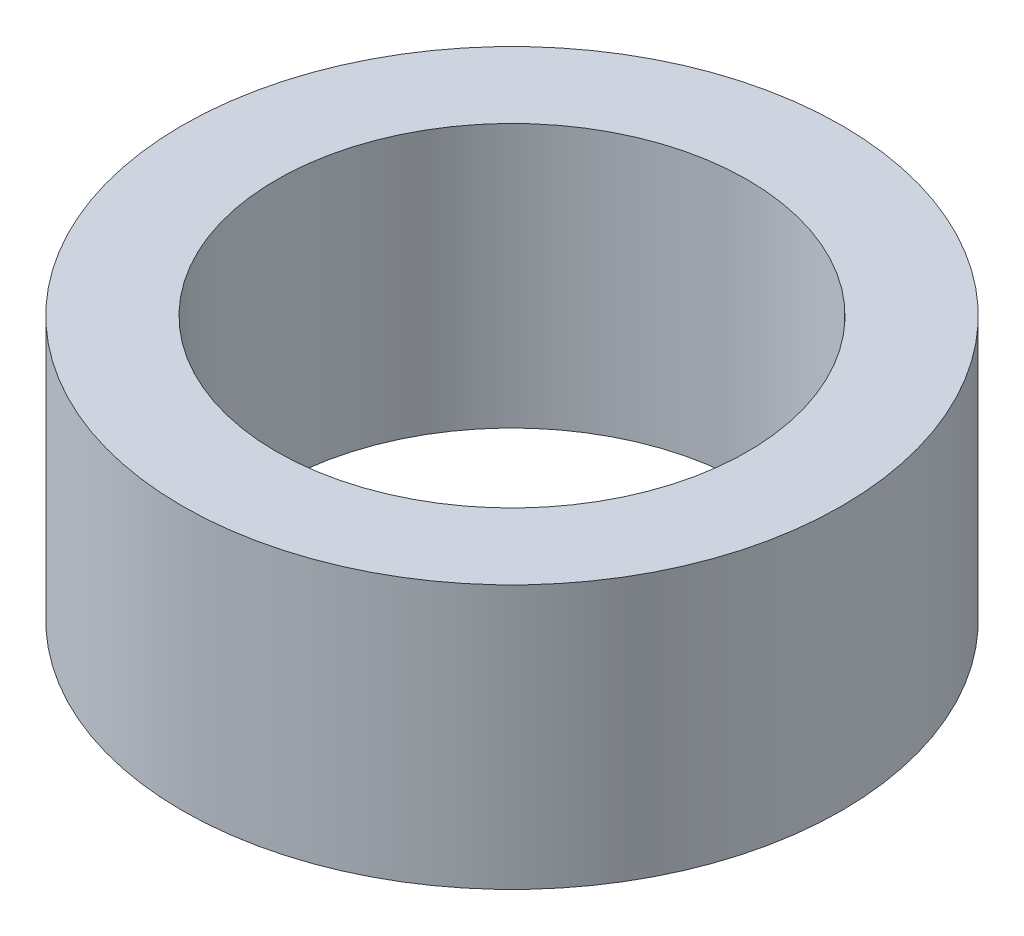
ISO-10303-21;
HEADER;
FILE_DESCRIPTION(('STEP AP214'),'2;1');
FILE_NAME('part.step','',(''),(''),'','','');
FILE_SCHEMA(('AUTOMOTIVE_DESIGN { 1 0 10303 214 1 1 1 1 }'));
ENDSEC;
DATA;
#1=APPLICATION_CONTEXT('core data for automotive mechanical design processes');
#2=APPLICATION_PROTOCOL_DEFINITION('international standard','automotive_design',2000,#1);
#3=PRODUCT_CONTEXT('',#1,'mechanical');
#4=PRODUCT('Part','Part','',(#3));
#5=PRODUCT_RELATED_PRODUCT_CATEGORY('part','',(#4));
#6=PRODUCT_DEFINITION_FORMATION('','',#4);
#7=PRODUCT_DEFINITION_CONTEXT('part definition',#1,'design');
#8=PRODUCT_DEFINITION('design','',#6,#7);
#9=PRODUCT_DEFINITION_SHAPE('','',#8);
#10=(LENGTH_UNIT() NAMED_UNIT(*) SI_UNIT(.MILLI.,.METRE.));
#11=(NAMED_UNIT(*) PLANE_ANGLE_UNIT() SI_UNIT($,.RADIAN.));
#12=(NAMED_UNIT(*) SI_UNIT($,.STERADIAN.) SOLID_ANGLE_UNIT());
#13=UNCERTAINTY_MEASURE_WITH_UNIT(LENGTH_MEASURE(1.E-05),#10,'distance_accuracy_value','');
#14=(GEOMETRIC_REPRESENTATION_CONTEXT(3) GLOBAL_UNCERTAINTY_ASSIGNED_CONTEXT((#13)) GLOBAL_UNIT_ASSIGNED_CONTEXT((#10,
#11,#12)) REPRESENTATION_CONTEXT('',''));
#15=CARTESIAN_POINT('',(0.,0.,0.));
#16=DIRECTION('',(0.,0.,1.));
#17=DIRECTION('',(1.,0.,0.));
#18=AXIS2_PLACEMENT_3D('',#15,#16,#17);
#19=CARTESIAN_POINT('',(0.,-4.445,0.));
#20=DIRECTION('',(0.,1.,0.));
#21=DIRECTION('',(0.,0.,1.));
#22=AXIS2_PLACEMENT_3D('',#19,#20,#21);
#23=CYLINDRICAL_SURFACE('',#22,5.55625);
#24=CARTESIAN_POINT('',(0.,-4.445,0.));
#25=DIRECTION('',(0.,1.,0.));
#26=DIRECTION('',(0.,0.,1.));
#27=AXIS2_PLACEMENT_3D('',#24,#25,#26);
#28=CIRCLE('',#27,5.55625);
#29=CARTESIAN_POINT('',(0.,-4.445,5.55625));
#30=VERTEX_POINT('',#29);
#31=EDGE_CURVE('E10',#30,#30,#28,.T.);
#32=ORIENTED_EDGE('',*,*,#31,.T.);
#33=EDGE_LOOP('',(#32));
#34=FACE_BOUND('',#33,.T.);
#35=CARTESIAN_POINT('',(0.,0.,0.));
#36=DIRECTION('',(0.,1.,0.));
#37=DIRECTION('',(0.,0.,1.));
#38=AXIS2_PLACEMENT_3D('',#35,#36,#37);
#39=CIRCLE('',#38,5.55625);
#40=CARTESIAN_POINT('',(0.,0.,5.55625));
#41=VERTEX_POINT('',#40);
#42=EDGE_CURVE('E42',#41,#41,#39,.T.);
#43=ORIENTED_EDGE('',*,*,#42,.F.);
#44=EDGE_LOOP('',(#43));
#45=FACE_BOUND('',#44,.T.);
#46=ADVANCED_FACE('F39',(#34,#45),#23,.T.);
#47=CARTESIAN_POINT('',(0.,-4.445,0.));
#48=DIRECTION('',(0.,1.,0.));
#49=DIRECTION('',(0.,0.,1.));
#50=AXIS2_PLACEMENT_3D('',#47,#48,#49);
#51=PLANE('',#50);
#52=CARTESIAN_POINT('',(0.,-4.445,0.));
#53=DIRECTION('',(0.,1.,0.));
#54=DIRECTION('',(0.,0.,1.));
#55=AXIS2_PLACEMENT_3D('',#52,#53,#54);
#56=CIRCLE('',#55,3.96875);
#57=CARTESIAN_POINT('',(0.,-4.445,3.96875));
#58=VERTEX_POINT('',#57);
#59=EDGE_CURVE('E49',#58,#58,#56,.T.);
#60=ORIENTED_EDGE('',*,*,#59,.T.);
#61=EDGE_LOOP('',(#60));
#62=FACE_BOUND('',#61,.T.);
#63=ORIENTED_EDGE('',*,*,#31,.F.);
#64=EDGE_LOOP('',(#63));
#65=FACE_BOUND('',#64,.T.);
#66=ADVANCED_FACE('F57',(#62,#65),#51,.F.);
#67=CARTESIAN_POINT('',(0.,0.,0.));
#68=DIRECTION('',(0.,1.,0.));
#69=DIRECTION('',(0.,0.,1.));
#70=AXIS2_PLACEMENT_3D('',#67,#68,#69);
#71=PLANE('',#70);
#72=CARTESIAN_POINT('',(0.,0.,0.));
#73=DIRECTION('',(0.,1.,0.));
#74=DIRECTION('',(0.,0.,1.));
#75=AXIS2_PLACEMENT_3D('',#72,#73,#74);
#76=CIRCLE('',#75,3.96875);
#77=CARTESIAN_POINT('',(0.,0.,3.96875));
#78=VERTEX_POINT('',#77);
#79=EDGE_CURVE('E51',#78,#78,#76,.T.);
#80=ORIENTED_EDGE('',*,*,#79,.F.);
#81=EDGE_LOOP('',(#80));
#82=FACE_BOUND('',#81,.T.);
#83=ORIENTED_EDGE('',*,*,#42,.T.);
#84=EDGE_LOOP('',(#83));
#85=FACE_BOUND('',#84,.T.);
#86=ADVANCED_FACE('F63',(#82,#85),#71,.T.);
#87=CARTESIAN_POINT('',(0.,-4.445,0.));
#88=DIRECTION('',(0.,1.,0.));
#89=DIRECTION('',(0.,0.,1.));
#90=AXIS2_PLACEMENT_3D('',#87,#88,#89);
#91=CYLINDRICAL_SURFACE('',#90,3.96875);
#92=ORIENTED_EDGE('',*,*,#59,.F.);
#93=EDGE_LOOP('',(#92));
#94=FACE_BOUND('',#93,.T.);
#95=ORIENTED_EDGE('',*,*,#79,.T.);
#96=EDGE_LOOP('',(#95));
#97=FACE_BOUND('',#96,.T.);
#98=ADVANCED_FACE('F60',(#94,#97),#91,.F.);
#99=CLOSED_SHELL('',(#46,#66,#86,#98));
#100=MANIFOLD_SOLID_BREP('B2',#99);
#101=ADVANCED_BREP_SHAPE_REPRESENTATION('',(#18,#100),#14);
#102=SHAPE_DEFINITION_REPRESENTATION(#9,#101);
ENDSEC;
END-ISO-10303-21;
